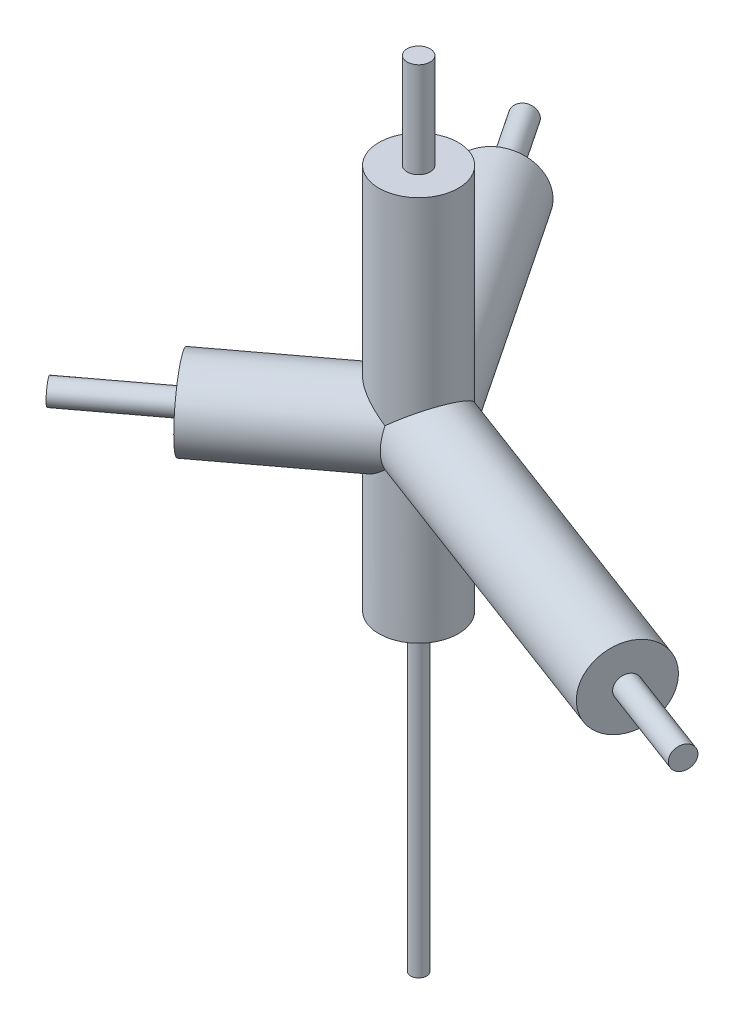
ISO-10303-21;
HEADER;
FILE_DESCRIPTION(('STEP AP214'),'2;1');
FILE_NAME('part.step','',(''),(''),'','','');
FILE_SCHEMA(('AUTOMOTIVE_DESIGN { 1 0 10303 214 1 1 1 1 }'));
ENDSEC;
DATA;
#1=APPLICATION_CONTEXT('core data for automotive mechanical design processes');
#2=APPLICATION_PROTOCOL_DEFINITION('international standard','automotive_design',2000,#1);
#3=PRODUCT_CONTEXT('',#1,'mechanical');
#4=PRODUCT('Part','Part','',(#3));
#5=PRODUCT_RELATED_PRODUCT_CATEGORY('part','',(#4));
#6=PRODUCT_DEFINITION_FORMATION('','',#4);
#7=PRODUCT_DEFINITION_CONTEXT('part definition',#1,'design');
#8=PRODUCT_DEFINITION('design','',#6,#7);
#9=PRODUCT_DEFINITION_SHAPE('','',#8);
#10=(LENGTH_UNIT() NAMED_UNIT(*) SI_UNIT(.MILLI.,.METRE.));
#11=(NAMED_UNIT(*) PLANE_ANGLE_UNIT() SI_UNIT($,.RADIAN.));
#12=(NAMED_UNIT(*) SI_UNIT($,.STERADIAN.) SOLID_ANGLE_UNIT());
#13=UNCERTAINTY_MEASURE_WITH_UNIT(LENGTH_MEASURE(1.E-05),#10,'distance_accuracy_value','');
#14=(GEOMETRIC_REPRESENTATION_CONTEXT(3) GLOBAL_UNCERTAINTY_ASSIGNED_CONTEXT((#13)) GLOBAL_UNIT_ASSIGNED_CONTEXT((#10,
#11,#12)) REPRESENTATION_CONTEXT('',''));
#15=CARTESIAN_POINT('',(0.,0.,0.));
#16=DIRECTION('',(0.,0.,1.));
#17=DIRECTION('',(1.,0.,0.));
#18=AXIS2_PLACEMENT_3D('',#15,#16,#17);
#19=CARTESIAN_POINT('',(0.,-60.,0.));
#20=DIRECTION('',(0.,1.,0.));
#21=DIRECTION('',(0.,0.,1.));
#22=AXIS2_PLACEMENT_3D('',#19,#20,#21);
#23=CYLINDRICAL_SURFACE('',#22,5.);
#24=CARTESIAN_POINT('',(0.,0.,0.));
#25=DIRECTION('',(-0.392232270276368,0.707106781186547,-0.588348405414552));
#26=DIRECTION('',(-0.392232270276368,-0.707106781186547,-0.588348405414552));
#27=AXIS2_PLACEMENT_3D('',#24,#25,#26);
#28=ELLIPSE('',#27,7.07106781186548,5.);
#29=CARTESIAN_POINT('',(3.1079944988561,-1.53486831091671,-3.9166784646024));
#30=VERTEX_POINT('',#29);
#31=CARTESIAN_POINT('',(-4.92822271917434,-3.43607694249102,-0.844168721414079));
#32=VERTEX_POINT('',#31);
#33=EDGE_CURVE('E11',#30,#32,#28,.T.);
#34=ORIENTED_EDGE('',*,*,#33,.F.);
#35=CARTESIAN_POINT('',(0.,0.,0.));
#36=DIRECTION('',(0.662084710881894,0.707106781186547,0.24828176658071));
#37=DIRECTION('',(0.662084710881894,-0.707106781186547,0.24828176658071));
#38=AXIS2_PLACEMENT_3D('',#35,#36,#37);
#39=ELLIPSE('',#38,7.07106781186548,5.);
#40=CARTESIAN_POINT('',(0.70942400043741,-2.4021103297356,4.94941588347589));
#41=VERTEX_POINT('',#40);
#42=EDGE_CURVE('E116',#30,#41,#39,.F.);
#43=ORIENTED_EDGE('',*,*,#42,.T.);
#44=CARTESIAN_POINT('',(0.,0.,0.));
#45=DIRECTION('',(-0.565685424949238,0.707106781186547,0.424264068711928));
#46=DIRECTION('',(-0.565685424949238,-0.707106781186547,0.424264068711928));
#47=AXIS2_PLACEMENT_3D('',#44,#45,#46);
#48=ELLIPSE('',#47,7.07106781186548,5.);
#49=EDGE_CURVE('E49',#41,#32,#48,.F.);
#50=ORIENTED_EDGE('',*,*,#49,.T.);
#51=EDGE_LOOP('',(#34,#43,#50));
#52=FACE_BOUND('',#51,.T.);
#53=CARTESIAN_POINT('',(0.,-20.6350832689629,0.));
#54=DIRECTION('',(0.,-1.,0.));
#55=DIRECTION('',(0.,0.,-1.));
#56=AXIS2_PLACEMENT_3D('',#53,#54,#55);
#57=CIRCLE('',#56,5.);
#58=CARTESIAN_POINT('',(0.,-20.6350832689629,5.));
#59=VERTEX_POINT('',#58);
#60=EDGE_CURVE('E37',#59,#59,#57,.F.);
#61=ORIENTED_EDGE('',*,*,#60,.T.);
#62=EDGE_LOOP('',(#61));
#63=FACE_BOUND('',#62,.T.);
#64=ADVANCED_FACE('F33',(#52,#63),#23,.T.);
#65=CARTESIAN_POINT('',(0.,0.,0.));
#66=DIRECTION('',(-0.565685424949238,-0.707106781186547,0.424264068711928));
#67=DIRECTION('',(-0.565685424949238,0.707106781186547,0.424264068711928));
#68=AXIS2_PLACEMENT_3D('',#65,#66,#67);
#69=ELLIPSE('',#68,7.07106781186548,5.);
#70=CARTESIAN_POINT('',(-4.92822271917434,3.43607694249102,-0.844168721414079));
#71=VERTEX_POINT('',#70);
#72=CARTESIAN_POINT('',(0.70942400043741,2.4021103297356,4.94941588347589));
#73=VERTEX_POINT('',#72);
#74=EDGE_CURVE('E68',#71,#73,#69,.F.);
#75=ORIENTED_EDGE('',*,*,#74,.T.);
#76=CARTESIAN_POINT('',(0.,0.,0.));
#77=DIRECTION('',(0.662084710881894,-0.707106781186547,0.24828176658071));
#78=DIRECTION('',(0.662084710881894,0.707106781186547,0.24828176658071));
#79=AXIS2_PLACEMENT_3D('',#76,#77,#78);
#80=ELLIPSE('',#79,7.07106781186548,5.);
#81=CARTESIAN_POINT('',(3.1079944988561,1.53486831091671,-3.9166784646024));
#82=VERTEX_POINT('',#81);
#83=EDGE_CURVE('E56',#73,#82,#80,.F.);
#84=ORIENTED_EDGE('',*,*,#83,.T.);
#85=CARTESIAN_POINT('',(0.,0.,0.));
#86=DIRECTION('',(-0.392232270276368,-0.707106781186547,-0.588348405414552));
#87=DIRECTION('',(-0.392232270276368,0.707106781186547,-0.588348405414552));
#88=AXIS2_PLACEMENT_3D('',#85,#86,#87);
#89=ELLIPSE('',#88,7.07106781186548,5.);
#90=EDGE_CURVE('E42',#71,#82,#89,.T.);
#91=ORIENTED_EDGE('',*,*,#90,.F.);
#92=EDGE_LOOP('',(#75,#84,#91));
#93=FACE_BOUND('',#92,.T.);
#94=CARTESIAN_POINT('',(0.,28.,0.));
#95=DIRECTION('',(0.,1.,0.));
#96=DIRECTION('',(0.,0.,1.));
#97=AXIS2_PLACEMENT_3D('',#94,#95,#96);
#98=CIRCLE('',#97,5.);
#99=CARTESIAN_POINT('',(0.,28.,5.));
#100=VERTEX_POINT('',#99);
#101=EDGE_CURVE('E82',#100,#100,#98,.T.);
#102=ORIENTED_EDGE('',*,*,#101,.F.);
#103=EDGE_LOOP('',(#102));
#104=FACE_BOUND('',#103,.T.);
#105=ADVANCED_FACE('F66',(#93,#104),#23,.T.);
#106=CARTESIAN_POINT('',(0.,0.,0.));
#107=DIRECTION('',(0.936329177569045,0.,0.351123441588392));
#108=DIRECTION('',(0.351123441588392,0.,-0.936329177569045));
#109=AXIS2_PLACEMENT_3D('',#106,#107,#108);
#110=CYLINDRICAL_SURFACE('',#109,5.);
#111=ORIENTED_EDGE('',*,*,#42,.F.);
#112=CARTESIAN_POINT('',(0.,0.,0.));
#113=DIRECTION('',(0.783335692920481,0.,0.62159889977122));
#114=DIRECTION('',(0.62159889977122,0.,-0.78333569292048));
#115=AXIS2_PLACEMENT_3D('',#112,#113,#114);
#116=ELLIPSE('',#115,5.25365701499964,5.);
#117=EDGE_CURVE('E86',#30,#82,#116,.T.);
#118=ORIENTED_EDGE('',*,*,#117,.T.);
#119=ORIENTED_EDGE('',*,*,#83,.F.);
#120=CARTESIAN_POINT('',(0.,0.,0.));
#121=DIRECTION('',(0.989883176695177,0.,-0.141884800087482));
#122=DIRECTION('',(0.141884800087482,0.,0.989883176695177));
#123=AXIS2_PLACEMENT_3D('',#120,#121,#122);
#124=ELLIPSE('',#123,5.7010110149797,5.);
#125=EDGE_CURVE('E81',#41,#73,#124,.F.);
#126=ORIENTED_EDGE('',*,*,#125,.F.);
#127=EDGE_LOOP('',(#111,#118,#119,#126));
#128=FACE_BOUND('',#127,.T.);
#129=CARTESIAN_POINT('',(42.0973832025049,0.,15.7865187009391));
#130=DIRECTION('',(0.936329177569046,0.,0.351123441588388));
#131=DIRECTION('',(0.351123441588388,0.,-0.936329177569046));
#132=AXIS2_PLACEMENT_3D('',#129,#130,#131);
#133=CIRCLE('',#132,5.);
#134=CARTESIAN_POINT('',(43.8530004104468,0.,11.1048728130939));
#135=VERTEX_POINT('',#134);
#136=EDGE_CURVE('E107',#135,#135,#133,.T.);
#137=ORIENTED_EDGE('',*,*,#136,.F.);
#138=EDGE_LOOP('',(#137));
#139=FACE_BOUND('',#138,.T.);
#140=ADVANCED_FACE('F160',(#128,#139),#110,.T.);
#141=CARTESIAN_POINT('',(0.,0.,0.));
#142=DIRECTION('',(-0.8,0.,0.6));
#143=DIRECTION('',(0.6,0.,0.8));
#144=AXIS2_PLACEMENT_3D('',#141,#142,#143);
#145=CYLINDRICAL_SURFACE('',#144,5.);
#146=ORIENTED_EDGE('',*,*,#49,.F.);
#147=ORIENTED_EDGE('',*,*,#125,.T.);
#148=ORIENTED_EDGE('',*,*,#74,.F.);
#149=CARTESIAN_POINT('',(0.,0.,0.));
#150=DIRECTION('',(0.168833744282816,0.,-0.985644543834868));
#151=DIRECTION('',(-0.985644543834868,0.,-0.168833744282816));
#152=AXIS2_PLACEMENT_3D('',#149,#150,#151);
#153=ELLIPSE('',#152,6.88275089032829,5.);
#154=EDGE_CURVE('E73',#32,#71,#153,.T.);
#155=ORIENTED_EDGE('',*,*,#154,.F.);
#156=EDGE_LOOP('',(#146,#147,#148,#155));
#157=FACE_BOUND('',#156,.T.);
#158=CARTESIAN_POINT('',(-17.0666666666666,0.,12.8000000000001));
#159=DIRECTION('',(-0.799999999999998,0.,0.600000000000003));
#160=DIRECTION('',(0.600000000000003,0.,0.799999999999998));
#161=AXIS2_PLACEMENT_3D('',#158,#159,#160);
#162=CIRCLE('',#161,5.);
#163=CARTESIAN_POINT('',(-14.0666666666666,0.,16.8000000000001));
#164=VERTEX_POINT('',#163);
#165=EDGE_CURVE('E98',#164,#164,#162,.T.);
#166=ORIENTED_EDGE('',*,*,#165,.F.);
#167=EDGE_LOOP('',(#166));
#168=FACE_BOUND('',#167,.T.);
#169=ADVANCED_FACE('F78',(#157,#168),#145,.T.);
#170=CARTESIAN_POINT('',(0.,0.,0.));
#171=DIRECTION('',(-0.554700196225229,0.,-0.832050294337844));
#172=DIRECTION('',(-0.832050294337844,0.,0.554700196225229));
#173=AXIS2_PLACEMENT_3D('',#170,#171,#172);
#174=CYLINDRICAL_SURFACE('',#173,5.);
#175=ORIENTED_EDGE('',*,*,#117,.F.);
#176=ORIENTED_EDGE('',*,*,#33,.T.);
#177=ORIENTED_EDGE('',*,*,#154,.T.);
#178=ORIENTED_EDGE('',*,*,#90,.T.);
#179=EDGE_LOOP('',(#175,#176,#177,#178));
#180=FACE_BOUND('',#179,.T.);
#181=CARTESIAN_POINT('',(-20.0102643119638,0.,-30.015396467946));
#182=DIRECTION('',(-0.554700196225226,0.,-0.832050294337846));
#183=DIRECTION('',(-0.832050294337846,0.,0.554700196225226));
#184=AXIS2_PLACEMENT_3D('',#181,#182,#183);
#185=CIRCLE('',#184,5.);
#186=CARTESIAN_POINT('',(-24.1705157836531,0.,-27.2418954868198));
#187=VERTEX_POINT('',#186);
#188=EDGE_CURVE('E91',#187,#187,#185,.T.);
#189=ORIENTED_EDGE('',*,*,#188,.F.);
#190=EDGE_LOOP('',(#189));
#191=FACE_BOUND('',#190,.T.);
#192=ADVANCED_FACE('F84',(#180,#191),#174,.T.);
#193=CARTESIAN_POINT('',(-20.0102643119638,0.,-30.015396467946));
#194=DIRECTION('',(-0.554700196225226,0.,-0.832050294337846));
#195=DIRECTION('',(-0.832050294337846,0.,0.554700196225226));
#196=AXIS2_PLACEMENT_3D('',#193,#194,#195);
#197=PLANE('',#196);
#198=CARTESIAN_POINT('',(-20.0102643119638,0.,-30.015396467946));
#199=DIRECTION('',(-0.554700196225226,0.,-0.832050294337846));
#200=DIRECTION('',(-0.832050294337846,0.,0.554700196225226));
#201=AXIS2_PLACEMENT_3D('',#198,#199,#200);
#202=CIRCLE('',#201,1.45);
#203=CARTESIAN_POINT('',(-21.2167372387537,0.,-29.2110811834194));
#204=VERTEX_POINT('',#203);
#205=EDGE_CURVE('E94',#204,#204,#202,.T.);
#206=ORIENTED_EDGE('',*,*,#205,.F.);
#207=EDGE_LOOP('',(#206));
#208=FACE_BOUND('',#207,.T.);
#209=ORIENTED_EDGE('',*,*,#188,.T.);
#210=EDGE_LOOP('',(#209));
#211=FACE_BOUND('',#210,.T.);
#212=ADVANCED_FACE('F184',(#208,#211),#197,.T.);
#213=CARTESIAN_POINT('',(-20.0102643119638,0.,-30.015396467946));
#214=DIRECTION('',(-0.554700196225226,0.,-0.832050294337845));
#215=DIRECTION('',(-0.832050294337846,0.,0.554700196225226));
#216=AXIS2_PLACEMENT_3D('',#213,#214,#215);
#217=CYLINDRICAL_SURFACE('',#216,1.45);
#218=ORIENTED_EDGE('',*,*,#205,.T.);
#219=EDGE_LOOP('',(#218));
#220=FACE_BOUND('',#219,.T.);
#221=CARTESIAN_POINT('',(-26.6666666666666,0.,-40.0000000000001));
#222=DIRECTION('',(-0.554700196225226,0.,-0.832050294337846));
#223=DIRECTION('',(-0.832050294337846,0.,0.554700196225226));
#224=AXIS2_PLACEMENT_3D('',#221,#222,#223);
#225=CIRCLE('',#224,1.45);
#226=CARTESIAN_POINT('',(-27.8731395934564,0.,-39.1956847154735));
#227=VERTEX_POINT('',#226);
#228=EDGE_CURVE('E95',#227,#227,#225,.T.);
#229=ORIENTED_EDGE('',*,*,#228,.F.);
#230=EDGE_LOOP('',(#229));
#231=FACE_BOUND('',#230,.T.);
#232=ADVANCED_FACE('F181',(#220,#231),#217,.T.);
#233=CARTESIAN_POINT('',(-26.6666666666667,0.,-40.));
#234=DIRECTION('',(0.554700196225226,0.,0.832050294337846));
#235=DIRECTION('',(0.832050294337846,0.,-0.554700196225226));
#236=AXIS2_PLACEMENT_3D('',#233,#234,#235);
#237=PLANE('',#236);
#238=ORIENTED_EDGE('',*,*,#228,.T.);
#239=EDGE_LOOP('',(#238));
#240=FACE_BOUND('',#239,.T.);
#241=ADVANCED_FACE('F179',(#240),#237,.F.);
#242=CARTESIAN_POINT('',(-17.0666666666666,0.,12.8000000000001));
#243=DIRECTION('',(-0.799999999999998,0.,0.600000000000003));
#244=DIRECTION('',(0.600000000000003,0.,0.799999999999998));
#245=AXIS2_PLACEMENT_3D('',#242,#243,#244);
#246=PLANE('',#245);
#247=CARTESIAN_POINT('',(-17.0666666666666,0.,12.8000000000001));
#248=DIRECTION('',(-0.799999999999998,0.,0.600000000000003));
#249=DIRECTION('',(0.600000000000003,0.,0.799999999999998));
#250=AXIS2_PLACEMENT_3D('',#247,#248,#249);
#251=CIRCLE('',#250,1.45);
#252=CARTESIAN_POINT('',(-16.1966666666666,0.,13.9600000000001));
#253=VERTEX_POINT('',#252);
#254=EDGE_CURVE('E103',#253,#253,#251,.T.);
#255=ORIENTED_EDGE('',*,*,#254,.F.);
#256=EDGE_LOOP('',(#255));
#257=FACE_BOUND('',#256,.T.);
#258=ORIENTED_EDGE('',*,*,#165,.T.);
#259=EDGE_LOOP('',(#258));
#260=FACE_BOUND('',#259,.T.);
#261=ADVANCED_FACE('F175',(#257,#260),#246,.T.);
#262=CARTESIAN_POINT('',(-17.0666666666666,0.,12.8000000000001));
#263=DIRECTION('',(-0.799999999999998,0.,0.600000000000003));
#264=DIRECTION('',(0.600000000000003,0.,0.799999999999998));
#265=AXIS2_PLACEMENT_3D('',#262,#263,#264);
#266=CYLINDRICAL_SURFACE('',#265,1.45);
#267=CARTESIAN_POINT('',(-26.6666666666666,0.,20.0000000000001));
#268=DIRECTION('',(-0.799999999999998,0.,0.600000000000003));
#269=DIRECTION('',(0.600000000000003,0.,0.799999999999998));
#270=AXIS2_PLACEMENT_3D('',#267,#268,#269);
#271=CIRCLE('',#270,1.45);
#272=CARTESIAN_POINT('',(-25.7966666666666,0.,21.1600000000001));
#273=VERTEX_POINT('',#272);
#274=EDGE_CURVE('E104',#273,#273,#271,.T.);
#275=CARTESIAN_POINT('',(-16.1966666666666,0.,13.9600000000001));
#276=CARTESIAN_POINT('',(-16.2966666666666,0.,14.0350000000001));
#277=CARTESIAN_POINT('',(-16.3966666666666,0.,14.1100000000001));
#278=CARTESIAN_POINT('',(-16.5966666666666,0.,14.2600000000001));
#279=CARTESIAN_POINT('',(-16.6966666666666,0.,14.3350000000001));
#280=CARTESIAN_POINT('',(-16.8966666666666,0.,14.4850000000001));
#281=CARTESIAN_POINT('',(-16.9966666666666,0.,14.5600000000001));
#282=CARTESIAN_POINT('',(-17.1966666666666,0.,14.7100000000001));
#283=CARTESIAN_POINT('',(-17.2966666666666,0.,14.7850000000001));
#284=CARTESIAN_POINT('',(-17.4966666666666,0.,14.9350000000001));
#285=CARTESIAN_POINT('',(-17.5966666666666,0.,15.0100000000001));
#286=CARTESIAN_POINT('',(-17.7966666666666,0.,15.1600000000001));
#287=CARTESIAN_POINT('',(-17.8966666666666,0.,15.2350000000001));
#288=CARTESIAN_POINT('',(-18.0966666666666,0.,15.3850000000001));
#289=CARTESIAN_POINT('',(-18.1966666666666,0.,15.4600000000001));
#290=CARTESIAN_POINT('',(-18.3966666666666,0.,15.6100000000001));
#291=CARTESIAN_POINT('',(-18.4966666666666,0.,15.6850000000001));
#292=CARTESIAN_POINT('',(-18.6966666666666,0.,15.8350000000001));
#293=CARTESIAN_POINT('',(-18.7966666666666,0.,15.9100000000001));
#294=CARTESIAN_POINT('',(-18.9966666666666,0.,16.0600000000001));
#295=CARTESIAN_POINT('',(-19.0966666666666,0.,16.1350000000001));
#296=CARTESIAN_POINT('',(-19.2966666666666,0.,16.2850000000001));
#297=CARTESIAN_POINT('',(-19.3966666666666,0.,16.3600000000001));
#298=CARTESIAN_POINT('',(-19.5966666666666,0.,16.5100000000001));
#299=CARTESIAN_POINT('',(-19.6966666666666,0.,16.5850000000001));
#300=CARTESIAN_POINT('',(-19.8966666666666,0.,16.7350000000001));
#301=CARTESIAN_POINT('',(-19.9966666666666,0.,16.8100000000001));
#302=CARTESIAN_POINT('',(-20.1966666666666,0.,16.9600000000001));
#303=CARTESIAN_POINT('',(-20.2966666666666,0.,17.0350000000001));
#304=CARTESIAN_POINT('',(-20.4966666666666,0.,17.1850000000001));
#305=CARTESIAN_POINT('',(-20.5966666666666,0.,17.2600000000001));
#306=CARTESIAN_POINT('',(-20.7966666666666,0.,17.4100000000001));
#307=CARTESIAN_POINT('',(-20.8966666666666,0.,17.4850000000001));
#308=CARTESIAN_POINT('',(-21.0966666666666,0.,17.6350000000001));
#309=CARTESIAN_POINT('',(-21.1966666666666,0.,17.7100000000001));
#310=CARTESIAN_POINT('',(-21.3966666666666,0.,17.8600000000001));
#311=CARTESIAN_POINT('',(-21.4966666666666,0.,17.9350000000001));
#312=CARTESIAN_POINT('',(-21.6966666666666,0.,18.0850000000001));
#313=CARTESIAN_POINT('',(-21.7966666666666,0.,18.1600000000001));
#314=CARTESIAN_POINT('',(-21.9966666666666,0.,18.3100000000001));
#315=CARTESIAN_POINT('',(-22.0966666666666,0.,18.3850000000001));
#316=CARTESIAN_POINT('',(-22.2966666666666,0.,18.5350000000001));
#317=CARTESIAN_POINT('',(-22.3966666666666,0.,18.6100000000001));
#318=CARTESIAN_POINT('',(-22.5966666666666,0.,18.7600000000001));
#319=CARTESIAN_POINT('',(-22.6966666666666,0.,18.8350000000001));
#320=CARTESIAN_POINT('',(-22.8966666666666,0.,18.9850000000001));
#321=CARTESIAN_POINT('',(-22.9966666666666,0.,19.0600000000001));
#322=CARTESIAN_POINT('',(-23.1966666666666,0.,19.2100000000001));
#323=CARTESIAN_POINT('',(-23.2966666666666,0.,19.2850000000001));
#324=CARTESIAN_POINT('',(-23.4966666666666,0.,19.4350000000001));
#325=CARTESIAN_POINT('',(-23.5966666666666,0.,19.5100000000001));
#326=CARTESIAN_POINT('',(-23.7966666666666,0.,19.6600000000001));
#327=CARTESIAN_POINT('',(-23.8966666666666,0.,19.7350000000001));
#328=CARTESIAN_POINT('',(-24.0966666666666,0.,19.8850000000001));
#329=CARTESIAN_POINT('',(-24.1966666666666,0.,19.9600000000001));
#330=CARTESIAN_POINT('',(-24.3966666666666,0.,20.1100000000001));
#331=CARTESIAN_POINT('',(-24.4966666666666,0.,20.1850000000001));
#332=CARTESIAN_POINT('',(-24.6966666666666,0.,20.3350000000001));
#333=CARTESIAN_POINT('',(-24.7966666666666,0.,20.4100000000001));
#334=CARTESIAN_POINT('',(-24.9966666666666,0.,20.5600000000001));
#335=CARTESIAN_POINT('',(-25.0966666666666,0.,20.6350000000001));
#336=CARTESIAN_POINT('',(-25.2966666666666,0.,20.7850000000001));
#337=CARTESIAN_POINT('',(-25.3966666666666,0.,20.8600000000001));
#338=CARTESIAN_POINT('',(-25.5966666666666,0.,21.0100000000001));
#339=CARTESIAN_POINT('',(-25.6966666666666,0.,21.0850000000001));
#340=CARTESIAN_POINT('',(-25.7966666666666,0.,21.1600000000001));
#341=B_SPLINE_CURVE_WITH_KNOTS('',3,(#275,#276,#277,#278,#279,#280,#281,#282,#283,#284,#285,
#286,#287,#288,#289,#290,#291,#292,#293,#294,#295,#296,#297,#298,#299,#300,#301,#302,#303,#304,
#305,#306,#307,#308,#309,#310,#311,#312,#313,#314,#315,#316,#317,#318,#319,#320,#321,#322,#323,
#324,#325,#326,#327,#328,#329,#330,#331,#332,#333,#334,#335,#336,#337,#338,#339,#340),
.UNSPECIFIED.,.F.,.F.,(4,2,2,2,2,2,2,2,2,2,2,2,2,2,2,2,2,2,2,2,2,2,2,2,2,2,2,2,2,2,2,2,4),(0.,
0.375000000000002,0.750000000000001,1.125,1.5,1.875,2.25,2.625,3.,3.375,3.75,4.125,4.5,4.875,
5.25,5.625,6.,6.375,6.75,7.125,7.5,7.875,8.25000000000001,8.625,9.00000000000001,
9.37500000000001,9.75,10.125,10.5,10.875,11.25,11.625,12.),.UNSPECIFIED.);
#342=EDGE_CURVE('BSEAM172',#253,#273,#341,.T.);
#343=ORIENTED_EDGE('',*,*,#254,.T.);
#344=ORIENTED_EDGE('',*,*,#274,.F.);
#345=ORIENTED_EDGE('',*,*,#342,.T.);
#346=ORIENTED_EDGE('',*,*,#342,.F.);
#347=EDGE_LOOP('',(#343,#345,#344,#346));
#348=FACE_BOUND('',#347,.T.);
#349=ADVANCED_FACE('F172',(#348),#266,.T.);
#350=CARTESIAN_POINT('',(-26.6666666666667,0.,20.));
#351=DIRECTION('',(-0.799999999999998,0.,0.600000000000003));
#352=DIRECTION('',(0.600000000000003,0.,0.799999999999998));
#353=AXIS2_PLACEMENT_3D('',#350,#351,#352);
#354=PLANE('',#353);
#355=ORIENTED_EDGE('',*,*,#274,.T.);
#356=EDGE_LOOP('',(#355));
#357=FACE_BOUND('',#356,.T.);
#358=ADVANCED_FACE('F170',(#357),#354,.T.);
#359=CARTESIAN_POINT('',(42.0973832025049,0.,15.7865187009391));
#360=DIRECTION('',(0.936329177569046,0.,0.351123441588388));
#361=DIRECTION('',(0.351123441588388,0.,-0.936329177569046));
#362=AXIS2_PLACEMENT_3D('',#359,#360,#361);
#363=PLANE('',#362);
#364=CARTESIAN_POINT('',(42.0973832025049,0.,15.7865187009391));
#365=DIRECTION('',(0.936329177569046,0.,0.351123441588388));
#366=DIRECTION('',(0.351123441588388,0.,-0.936329177569046));
#367=AXIS2_PLACEMENT_3D('',#364,#365,#366);
#368=CIRCLE('',#367,1.45);
#369=CARTESIAN_POINT('',(42.606512192808,0.,14.428841393464));
#370=VERTEX_POINT('',#369);
#371=EDGE_CURVE('E112',#370,#370,#368,.T.);
#372=ORIENTED_EDGE('',*,*,#371,.F.);
#373=EDGE_LOOP('',(#372));
#374=FACE_BOUND('',#373,.T.);
#375=ORIENTED_EDGE('',*,*,#136,.T.);
#376=EDGE_LOOP('',(#375));
#377=FACE_BOUND('',#376,.T.);
#378=ADVANCED_FACE('F166',(#374,#377),#363,.T.);
#379=CARTESIAN_POINT('',(42.0973832025049,0.,15.7865187009391));
#380=DIRECTION('',(0.936329177569046,0.,0.351123441588388));
#381=DIRECTION('',(0.351123441588388,0.,-0.936329177569046));
#382=AXIS2_PLACEMENT_3D('',#379,#380,#381);
#383=CYLINDRICAL_SURFACE('',#382,1.45);
#384=CARTESIAN_POINT('',(53.3333333333334,0.,19.9999999999998));
#385=DIRECTION('',(0.936329177569046,0.,0.351123441588388));
#386=DIRECTION('',(0.351123441588388,0.,-0.936329177569046));
#387=AXIS2_PLACEMENT_3D('',#384,#385,#386);
#388=CIRCLE('',#387,1.45);
#389=CARTESIAN_POINT('',(53.8424623236366,0.,18.6423226925247));
#390=VERTEX_POINT('',#389);
#391=EDGE_CURVE('E113',#390,#390,#388,.T.);
#392=CARTESIAN_POINT('',(42.606512192808,0.,14.428841393464));
#393=CARTESIAN_POINT('',(42.7235533400041,0.,14.4727318236626));
#394=CARTESIAN_POINT('',(42.8405944872003,0.,14.5166222538611));
#395=CARTESIAN_POINT('',(43.0746767815925,0.,14.6044031142582));
#396=CARTESIAN_POINT('',(43.1917179287887,0.,14.6482935444568));
#397=CARTESIAN_POINT('',(43.4258002231809,0.,14.7360744048539));
#398=CARTESIAN_POINT('',(43.5428413703771,0.,14.7799648350524));
#399=CARTESIAN_POINT('',(43.7769236647693,0.,14.8677456954495));
#400=CARTESIAN_POINT('',(43.8939648119655,0.,14.9116361256481));
#401=CARTESIAN_POINT('',(44.1280471063577,0.,14.9994169860452));
#402=CARTESIAN_POINT('',(44.2450882535538,0.,15.0433074162437));
#403=CARTESIAN_POINT('',(44.4791705479461,0.,15.1310882766408));
#404=CARTESIAN_POINT('',(44.5962116951422,0.,15.1749787068394));
#405=CARTESIAN_POINT('',(44.8302939895345,0.,15.2627595672364));
#406=CARTESIAN_POINT('',(44.9473351367306,0.,15.306649997435));
#407=CARTESIAN_POINT('',(45.1814174311229,0.,15.3944308578321));
#408=CARTESIAN_POINT('',(45.298458578319,0.,15.4383212880306));
#409=CARTESIAN_POINT('',(45.5325408727113,0.,15.5261021484277));
#410=CARTESIAN_POINT('',(45.6495820199074,0.,15.5699925786263));
#411=CARTESIAN_POINT('',(45.8836643142997,0.,15.6577734390234));
#412=CARTESIAN_POINT('',(46.0007054614958,0.,15.7016638692219));
#413=CARTESIAN_POINT('',(46.2347877558881,0.,15.789444729619));
#414=CARTESIAN_POINT('',(46.3518289030842,0.,15.8333351598176));
#415=CARTESIAN_POINT('',(46.5859111974765,0.,15.9211160202147));
#416=CARTESIAN_POINT('',(46.7029523446726,0.,15.9650064504132));
#417=CARTESIAN_POINT('',(46.9370346390649,0.,16.0527873108103));
#418=CARTESIAN_POINT('',(47.054075786261,0.,16.0966777410089));
#419=CARTESIAN_POINT('',(47.2881580806532,0.,16.184458601406));
#420=CARTESIAN_POINT('',(47.4051992278494,0.,16.2283490316045));
#421=CARTESIAN_POINT('',(47.6392815222416,0.,16.3161298920016));
#422=CARTESIAN_POINT('',(47.7563226694378,0.,16.3600203222002));
#423=CARTESIAN_POINT('',(47.99040496383,0.,16.4478011825973));
#424=CARTESIAN_POINT('',(48.1074461110262,0.,16.4916916127958));
#425=CARTESIAN_POINT('',(48.3415284054184,0.,16.5794724731929));
#426=CARTESIAN_POINT('',(48.4585695526145,0.,16.6233629033915));
#427=CARTESIAN_POINT('',(48.6926518470068,0.,16.7111437637886));
#428=CARTESIAN_POINT('',(48.8096929942029,0.,16.7550341939871));
#429=CARTESIAN_POINT('',(49.0437752885952,0.,16.8428150543842));
#430=CARTESIAN_POINT('',(49.1608164357913,0.,16.8867054845827));
#431=CARTESIAN_POINT('',(49.3948987301836,0.,16.9744863449798));
#432=CARTESIAN_POINT('',(49.5119398773797,0.,17.0183767751784));
#433=CARTESIAN_POINT('',(49.746022171772,0.,17.1061576355755));
#434=CARTESIAN_POINT('',(49.8630633189681,0.,17.150048065774));
#435=CARTESIAN_POINT('',(50.0971456133604,0.,17.2378289261711));
#436=CARTESIAN_POINT('',(50.2141867605565,0.,17.2817193563697));
#437=CARTESIAN_POINT('',(50.4482690549488,0.,17.3695002167668));
#438=CARTESIAN_POINT('',(50.5653102021449,0.,17.4133906469653));
#439=CARTESIAN_POINT('',(50.7993924965372,0.,17.5011715073624));
#440=CARTESIAN_POINT('',(50.9164336437333,0.,17.545061937561));
#441=CARTESIAN_POINT('',(51.1505159381256,0.,17.6328427979581));
#442=CARTESIAN_POINT('',(51.2675570853217,0.,17.6767332281566));
#443=CARTESIAN_POINT('',(51.501639379714,0.,17.7645140885537));
#444=CARTESIAN_POINT('',(51.6186805269101,0.,17.8084045187523));
#445=CARTESIAN_POINT('',(51.8527628213023,0.,17.8961853791494));
#446=CARTESIAN_POINT('',(51.9698039684985,0.,17.9400758093479));
#447=CARTESIAN_POINT('',(52.2038862628907,0.,18.027856669745));
#448=CARTESIAN_POINT('',(52.3209274100869,0.,18.0717470999436));
#449=CARTESIAN_POINT('',(52.5550097044791,0.,18.1595279603407));
#450=CARTESIAN_POINT('',(52.6720508516753,0.,18.2034183905392));
#451=CARTESIAN_POINT('',(52.9061331460675,0.,18.2911992509363));
#452=CARTESIAN_POINT('',(53.0231742932637,0.,18.3350896811348));
#453=CARTESIAN_POINT('',(53.2572565876559,0.,18.4228705415319));
#454=CARTESIAN_POINT('',(53.374297734852,0.,18.4667609717305));
#455=CARTESIAN_POINT('',(53.6083800292443,0.,18.5545418321276));
#456=CARTESIAN_POINT('',(53.7254211764404,0.,18.5984322623261));
#457=CARTESIAN_POINT('',(53.8424623236366,0.,18.6423226925247));
#458=B_SPLINE_CURVE_WITH_KNOTS('',3,(#392,#393,#394,#395,#396,#397,#398,#399,#400,#401,#402,
#403,#404,#405,#406,#407,#408,#409,#410,#411,#412,#413,#414,#415,#416,#417,#418,#419,#420,#421,
#422,#423,#424,#425,#426,#427,#428,#429,#430,#431,#432,#433,#434,#435,#436,#437,#438,#439,#440,
#441,#442,#443,#444,#445,#446,#447,#448,#449,#450,#451,#452,#453,#454,#455,#456,#457),
.UNSPECIFIED.,.F.,.F.,(4,2,2,2,2,2,2,2,2,2,2,2,2,2,2,2,2,2,2,2,2,2,2,2,2,2,2,2,2,2,2,2,4),(0.,
0.375000000000001,0.750000000000001,1.125,1.5,1.875,2.25,2.625,3.,3.375,3.75,4.12500000000001,
4.5,4.87500000000001,5.25,5.625,6.,6.375,6.75,7.125,7.5,7.875,8.25000000000001,8.625,
9.00000000000001,9.375,9.75000000000001,10.125,10.5,10.875,11.25,11.625,12.),.UNSPECIFIED.);
#459=EDGE_CURVE('BSEAM163',#370,#390,#458,.T.);
#460=ORIENTED_EDGE('',*,*,#371,.T.);
#461=ORIENTED_EDGE('',*,*,#391,.F.);
#462=ORIENTED_EDGE('',*,*,#459,.T.);
#463=ORIENTED_EDGE('',*,*,#459,.F.);
#464=EDGE_LOOP('',(#460,#462,#461,#463));
#465=FACE_BOUND('',#464,.T.);
#466=ADVANCED_FACE('F163',(#465),#383,.T.);
#467=CARTESIAN_POINT('',(53.3333333333333,0.,20.));
#468=DIRECTION('',(0.936329177569046,0.,0.351123441588388));
#469=DIRECTION('',(0.351123441588388,0.,-0.936329177569046));
#470=AXIS2_PLACEMENT_3D('',#467,#468,#469);
#471=PLANE('',#470);
#472=ORIENTED_EDGE('',*,*,#391,.T.);
#473=EDGE_LOOP('',(#472));
#474=FACE_BOUND('',#473,.T.);
#475=ADVANCED_FACE('F35',(#474),#471,.T.);
#476=CARTESIAN_POINT('',(0.,28.,0.));
#477=DIRECTION('',(0.,1.,0.));
#478=DIRECTION('',(0.,0.,1.));
#479=AXIS2_PLACEMENT_3D('',#476,#477,#478);
#480=PLANE('',#479);
#481=CARTESIAN_POINT('',(0.,28.,0.));
#482=DIRECTION('',(0.,1.,0.));
#483=DIRECTION('',(0.,0.,1.));
#484=AXIS2_PLACEMENT_3D('',#481,#482,#483);
#485=CIRCLE('',#484,1.45);
#486=CARTESIAN_POINT('',(0.,28.,1.45));
#487=VERTEX_POINT('',#486);
#488=EDGE_CURVE('E124',#487,#487,#485,.T.);
#489=ORIENTED_EDGE('',*,*,#488,.F.);
#490=EDGE_LOOP('',(#489));
#491=FACE_BOUND('',#490,.T.);
#492=ORIENTED_EDGE('',*,*,#101,.T.);
#493=EDGE_LOOP('',(#492));
#494=FACE_BOUND('',#493,.T.);
#495=ADVANCED_FACE('F254',(#491,#494),#480,.T.);
#496=CARTESIAN_POINT('',(0.,28.,0.));
#497=DIRECTION('',(0.,1.,0.));
#498=DIRECTION('',(0.,0.,1.));
#499=AXIS2_PLACEMENT_3D('',#496,#497,#498);
#500=CYLINDRICAL_SURFACE('',#499,1.45);
#501=ORIENTED_EDGE('',*,*,#488,.T.);
#502=EDGE_LOOP('',(#501));
#503=FACE_BOUND('',#502,.T.);
#504=CARTESIAN_POINT('',(0.,40.,0.));
#505=DIRECTION('',(0.,1.,0.));
#506=DIRECTION('',(0.,0.,1.));
#507=AXIS2_PLACEMENT_3D('',#504,#505,#506);
#508=CIRCLE('',#507,1.45);
#509=CARTESIAN_POINT('',(0.,40.,1.45));
#510=VERTEX_POINT('',#509);
#511=EDGE_CURVE('E125',#510,#510,#508,.T.);
#512=ORIENTED_EDGE('',*,*,#511,.F.);
#513=EDGE_LOOP('',(#512));
#514=FACE_BOUND('',#513,.T.);
#515=ADVANCED_FACE('F261',(#503,#514),#500,.T.);
#516=CARTESIAN_POINT('',(0.,40.,0.));
#517=DIRECTION('',(0.,1.,0.));
#518=DIRECTION('',(0.,0.,1.));
#519=AXIS2_PLACEMENT_3D('',#516,#517,#518);
#520=PLANE('',#519);
#521=ORIENTED_EDGE('',*,*,#511,.T.);
#522=EDGE_LOOP('',(#521));
#523=FACE_BOUND('',#522,.T.);
#524=ADVANCED_FACE('F153',(#523),#520,.T.);
#525=CARTESIAN_POINT('',(0.,-1000.,-3.49148133884313E-12));
#526=DIRECTION('',(0.,-1.,0.));
#527=DIRECTION('',(0.,0.,-1.));
#528=AXIS2_PLACEMENT_3D('',#525,#526,#527);
#529=CYLINDRICAL_SURFACE('',#528,1.00000000000014);
#530=CARTESIAN_POINT('',(0.,-20.0250156445618,0.));
#531=DIRECTION('',(0.,-1.,0.));
#532=DIRECTION('',(0.,0.,-1.));
#533=AXIS2_PLACEMENT_3D('',#530,#531,#532);
#534=CIRCLE('',#533,1.00000000000007);
#535=CARTESIAN_POINT('',(0.,-20.0250156445618,0.999999999999606));
#536=VERTEX_POINT('',#535);
#537=EDGE_CURVE('E133',#536,#536,#534,.T.);
#538=ORIENTED_EDGE('',*,*,#537,.T.);
#539=EDGE_LOOP('',(#538));
#540=FACE_BOUND('',#539,.T.);
#541=CARTESIAN_POINT('',(0.,-60.0000000000001,-2.09488880330589E-13));
#542=DIRECTION('',(0.,-1.,0.));
#543=DIRECTION('',(0.,0.,-1.));
#544=AXIS2_PLACEMENT_3D('',#541,#542,#543);
#545=CIRCLE('',#544,1.0000000000002);
#546=CARTESIAN_POINT('',(0.,-60.,-1.00000000000041));
#547=VERTEX_POINT('',#546);
#548=EDGE_CURVE('E130',#547,#547,#545,.T.);
#549=ORIENTED_EDGE('',*,*,#548,.F.);
#550=EDGE_LOOP('',(#549));
#551=FACE_BOUND('',#550,.T.);
#552=ADVANCED_FACE('F145',(#540,#551),#529,.T.);
#553=CARTESIAN_POINT('',(0.,-40.,0.));
#554=DIRECTION('',(0.,-1.,0.));
#555=DIRECTION('',(0.,0.,1.));
#556=AXIS2_PLACEMENT_3D('',#553,#554,#555);
#557=SPHERICAL_SURFACE('',#556,20.);
#558=CARTESIAN_POINT('',(0.,-20.6350832689629,5.));
#559=CARTESIAN_POINT('',(0.,-20.6245280900988,4.95911997574553));
#560=CARTESIAN_POINT('',(0.,-20.614102363671,4.91820652703756));
#561=CARTESIAN_POINT('',(0.,-20.5935102256413,4.83631442373788));
#562=CARTESIAN_POINT('',(0.,-20.5833438140395,4.79533576914619));
#563=CARTESIAN_POINT('',(0.,-20.5632707156151,4.71331489710238));
#564=CARTESIAN_POINT('',(0.,-20.5533640287926,4.67227267965026));
#565=CARTESIAN_POINT('',(0.,-20.5338107766764,4.59012632815907));
#566=CARTESIAN_POINT('',(0.,-20.5241642113827,4.54902219411999));
#567=CARTESIAN_POINT('',(0.,-20.5051315893872,4.46675365802391));
#568=CARTESIAN_POINT('',(0.,-20.4957455326855,4.42558925596691));
#569=CARTESIAN_POINT('',(0.,-20.4772343042887,4.34320183487157));
#570=CARTESIAN_POINT('',(0.,-20.4681091325936,4.30197881583324));
#571=CARTESIAN_POINT('',(0.,-20.4501200402146,4.21947581414935));
#572=CARTESIAN_POINT('',(0.,-20.4412561195307,4.17819583150381));
#573=CARTESIAN_POINT('',(0.,-20.4237898846863,4.09558055826794));
#574=CARTESIAN_POINT('',(0.,-20.4151875705256,4.05424526767762));
#575=CARTESIAN_POINT('',(0.,-20.3982448937509,3.97152103643197));
#576=CARTESIAN_POINT('',(0.,-20.3899045311368,3.93013209577664));
#577=CARTESIAN_POINT('',(0.,-20.373486091971,3.8473022244328));
#578=CARTESIAN_POINT('',(0.,-20.3654080154193,3.8058612937443));
#579=CARTESIAN_POINT('',(0.,-20.3495144723747,3.72292910445109));
#580=CARTESIAN_POINT('',(0.,-20.3416990058817,3.68143784584638));
#581=CARTESIAN_POINT('',(0.,-20.3263309964181,3.59840666485633));
#582=CARTESIAN_POINT('',(0.,-20.3187784534474,3.55686674247098));
#583=CARTESIAN_POINT('',(0.,-20.3039365939465,3.473739900007));
#584=CARTESIAN_POINT('',(0.,-20.2966472774162,3.43215297992837));
#585=CARTESIAN_POINT('',(0.,-20.2823321631567,3.34893381005018));
#586=CARTESIAN_POINT('',(0.,-20.2753063654275,3.30730156025062));
#587=CARTESIAN_POINT('',(0.,-20.2615185705615,3.22399340072102));
#588=CARTESIAN_POINT('',(0.,-20.2547565734247,3.18231749099097));
#589=CARTESIAN_POINT('',(0.,-20.2414966509545,3.09892368314194));
#590=CARTESIAN_POINT('',(0.,-20.234998725621,3.05720578502296));
#591=CARTESIAN_POINT('',(0.,-20.2222672073768,2.97372967362171));
#592=CARTESIAN_POINT('',(0.,-20.2160336144661,2.93197146033943));
#593=CARTESIAN_POINT('',(0.,-20.2038310110849,2.84841639345417));
#594=CARTESIAN_POINT('',(0.,-20.1978620006145,2.8066195398512));
#595=CARTESIAN_POINT('',(0.,-20.1861888015196,2.72298886871692));
#596=CARTESIAN_POINT('',(0.,-20.1804846128952,2.68115505118563));
#597=CARTESIAN_POINT('',(0.,-20.1693412862765,2.59745213006966));
#598=CARTESIAN_POINT('',(0.,-20.1639021482822,2.55558302648499));
#599=CARTESIAN_POINT('',(0.,-20.1532891410773,2.47181121255247));
#600=CARTESIAN_POINT('',(0.,-20.1481152718666,2.42990850220462));
#601=CARTESIAN_POINT('',(0.,-20.138033009743,2.34607115538383));
#602=CARTESIAN_POINT('',(0.,-20.1331246168301,2.3041365189109));
#603=CARTESIAN_POINT('',(0.,-20.1235735041682,2.22023700175855));
#604=CARTESIAN_POINT('',(0.,-20.1189307844193,2.17827212107914));
#605=CARTESIAN_POINT('',(0.,-20.1099112042961,2.09431379864545));
#606=CARTESIAN_POINT('',(0.,-20.1055343439218,2.05232035689118));
#607=CARTESIAN_POINT('',(0.,-20.0970466580957,1.96830659658495));
#608=CARTESIAN_POINT('',(0.,-20.0929358326438,1.92628627803298));
#609=CARTESIAN_POINT('',(0.,-20.0849803815391,1.84222044948654));
#610=CARTESIAN_POINT('',(0.,-20.0811357558862,1.80017493949206));
#611=CARTESIAN_POINT('',(0.,-20.0737128585832,1.71606041442595));
#612=CARTESIAN_POINT('',(0.,-20.070134586933,1.67399139935431));
#613=CARTESIAN_POINT('',(0.,-20.0632445411415,1.58983155144279));
#614=CARTESIAN_POINT('',(0.,-20.0599327670001,1.54774071860291));
#615=CARTESIAN_POINT('',(0.,-20.0535758490985,1.46353892333579));
#616=CARTESIAN_POINT('',(0.,-20.0505307053384,1.42142796090855));
#617=CARTESIAN_POINT('',(0.,-20.0447071701718,1.33718759546656));
#618=CARTESIAN_POINT('',(0.,-20.0419287787653,1.29505819245182));
#619=CARTESIAN_POINT('',(0.,-20.0366388603485,1.21078263553094));
#620=CARTESIAN_POINT('',(0.,-20.0341273333381,1.1686364816248));
#621=CARTESIAN_POINT('',(0.,-20.0293712421831,1.08432911345094));
#622=CARTESIAN_POINT('',(0.,-20.0271266780385,1.04216789918322));
#623=CARTESIAN_POINT('',(0.,-20.0250156445618,0.999999999999606));
#624=B_SPLINE_CURVE_WITH_KNOTS('',3,(#558,#559,#560,#561,#562,#563,#564,#565,#566,#567,#568,
#569,#570,#571,#572,#573,#574,#575,#576,#577,#578,#579,#580,#581,#582,#583,#584,#585,#586,#587,
#588,#589,#590,#591,#592,#593,#594,#595,#596,#597,#598,#599,#600,#601,#602,#603,#604,#605,#606,
#607,#608,#609,#610,#611,#612,#613,#614,#615,#616,#617,#618,#619,#620,#621,#622,#623),
.UNSPECIFIED.,.F.,.F.,(4,2,2,2,2,2,2,2,2,2,2,2,2,2,2,2,2,2,2,2,2,2,2,2,2,2,2,2,2,2,2,2,4),(0.,
0.126661912285558,0.253323824571116,0.379985736856669,0.506647649142224,0.633309561427783,
0.759971473713335,0.886633385998892,1.01329529828445,1.13995721057001,1.26661912285556,
1.39328103514112,1.51994294742667,1.64660485971223,1.77326677199778,1.89992868428334,
2.0265905965689,2.15325250885446,2.27991442114001,2.40657633342557,2.53323824571112,
2.65990015799668,2.78656207028223,2.91322398256779,3.03988589485335,3.1665478071389,
3.29320971942446,3.41987163171001,3.54653354399557,3.67319545628113,3.79985736856668,
3.92651928085224,4.0531811931378),.UNSPECIFIED.);
#625=EDGE_CURVE('BSEAM141',#59,#536,#624,.T.);
#626=ORIENTED_EDGE('',*,*,#60,.F.);
#627=ORIENTED_EDGE('',*,*,#537,.F.);
#628=ORIENTED_EDGE('',*,*,#625,.T.);
#629=ORIENTED_EDGE('',*,*,#625,.F.);
#630=EDGE_LOOP('',(#626,#628,#627,#629));
#631=FACE_BOUND('',#630,.T.);
#632=ADVANCED_FACE('F141',(#631),#557,.F.);
#633=CARTESIAN_POINT('',(0.,-60.,0.));
#634=DIRECTION('',(0.,1.,0.));
#635=DIRECTION('',(0.,0.,1.));
#636=AXIS2_PLACEMENT_3D('',#633,#634,#635);
#637=PLANE('',#636);
#638=ORIENTED_EDGE('',*,*,#548,.T.);
#639=EDGE_LOOP('',(#638));
#640=FACE_BOUND('',#639,.T.);
#641=ADVANCED_FACE('F144',(#640),#637,.F.);
#642=CLOSED_SHELL('',(#64,#105,#140,#169,#192,#212,#232,#241,#261,#349,#358,#378,#466,#475,#495,
#515,#524,#552,#632,#641));
#643=MANIFOLD_SOLID_BREP('B2',#642);
#644=ADVANCED_BREP_SHAPE_REPRESENTATION('',(#18,#643),#14);
#645=SHAPE_DEFINITION_REPRESENTATION(#9,#644);
ENDSEC;
END-ISO-10303-21;
